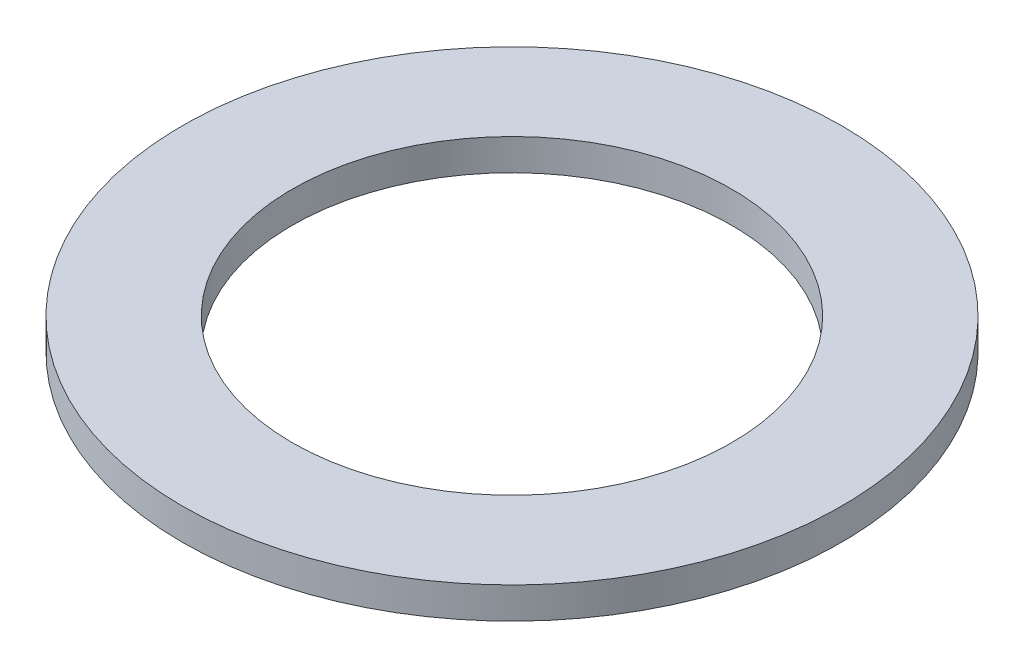
ISO-10303-21;
HEADER;
FILE_DESCRIPTION(('STEP AP214'),'2;1');
FILE_NAME('part.step','',(''),(''),'','','');
FILE_SCHEMA(('AUTOMOTIVE_DESIGN { 1 0 10303 214 1 1 1 1 }'));
ENDSEC;
DATA;
#1=APPLICATION_CONTEXT('core data for automotive mechanical design processes');
#2=APPLICATION_PROTOCOL_DEFINITION('international standard','automotive_design',2000,#1);
#3=PRODUCT_CONTEXT('',#1,'mechanical');
#4=PRODUCT('Part','Part','',(#3));
#5=PRODUCT_RELATED_PRODUCT_CATEGORY('part','',(#4));
#6=PRODUCT_DEFINITION_FORMATION('','',#4);
#7=PRODUCT_DEFINITION_CONTEXT('part definition',#1,'design');
#8=PRODUCT_DEFINITION('design','',#6,#7);
#9=PRODUCT_DEFINITION_SHAPE('','',#8);
#10=(LENGTH_UNIT() NAMED_UNIT(*) SI_UNIT(.MILLI.,.METRE.));
#11=(NAMED_UNIT(*) PLANE_ANGLE_UNIT() SI_UNIT($,.RADIAN.));
#12=(NAMED_UNIT(*) SI_UNIT($,.STERADIAN.) SOLID_ANGLE_UNIT());
#13=UNCERTAINTY_MEASURE_WITH_UNIT(LENGTH_MEASURE(1.E-05),#10,'distance_accuracy_value','');
#14=(GEOMETRIC_REPRESENTATION_CONTEXT(3) GLOBAL_UNCERTAINTY_ASSIGNED_CONTEXT((#13)) GLOBAL_UNIT_ASSIGNED_CONTEXT((#10,
#11,#12)) REPRESENTATION_CONTEXT('',''));
#15=CARTESIAN_POINT('',(0.,0.,0.));
#16=DIRECTION('',(0.,0.,1.));
#17=DIRECTION('',(1.,0.,0.));
#18=AXIS2_PLACEMENT_3D('',#15,#16,#17);
#19=CARTESIAN_POINT('',(0.,1.,0.));
#20=DIRECTION('',(0.,1.,0.));
#21=DIRECTION('',(0.,0.,1.));
#22=AXIS2_PLACEMENT_3D('',#19,#20,#21);
#23=PLANE('',#22);
#24=CARTESIAN_POINT('',(0.,1.,0.));
#25=DIRECTION('',(0.,1.,0.));
#26=DIRECTION('',(0.,0.,1.));
#27=AXIS2_PLACEMENT_3D('',#24,#25,#26);
#28=CIRCLE('',#27,10.5);
#29=CARTESIAN_POINT('',(0.,1.,10.5));
#30=VERTEX_POINT('',#29);
#31=EDGE_CURVE('E10',#30,#30,#28,.T.);
#32=ORIENTED_EDGE('',*,*,#31,.T.);
#33=EDGE_LOOP('',(#32));
#34=FACE_BOUND('',#33,.T.);
#35=CARTESIAN_POINT('',(0.,1.,0.));
#36=DIRECTION('',(0.,1.,0.));
#37=DIRECTION('',(0.,0.,1.));
#38=AXIS2_PLACEMENT_3D('',#35,#36,#37);
#39=CIRCLE('',#38,7.);
#40=CARTESIAN_POINT('',(0.,1.,7.));
#41=VERTEX_POINT('',#40);
#42=EDGE_CURVE('E50',#41,#41,#39,.T.);
#43=ORIENTED_EDGE('',*,*,#42,.F.);
#44=EDGE_LOOP('',(#43));
#45=FACE_BOUND('',#44,.T.);
#46=ADVANCED_FACE('F37',(#34,#45),#23,.T.);
#47=CARTESIAN_POINT('',(0.,0.,0.));
#48=DIRECTION('',(0.,1.,0.));
#49=DIRECTION('',(0.,0.,1.));
#50=AXIS2_PLACEMENT_3D('',#47,#48,#49);
#51=PLANE('',#50);
#52=CARTESIAN_POINT('',(0.,0.,0.));
#53=DIRECTION('',(0.,1.,0.));
#54=DIRECTION('',(0.,0.,1.));
#55=AXIS2_PLACEMENT_3D('',#52,#53,#54);
#56=CIRCLE('',#55,10.5);
#57=CARTESIAN_POINT('',(0.,0.,10.5));
#58=VERTEX_POINT('',#57);
#59=EDGE_CURVE('E41',#58,#58,#56,.T.);
#60=ORIENTED_EDGE('',*,*,#59,.F.);
#61=EDGE_LOOP('',(#60));
#62=FACE_BOUND('',#61,.T.);
#63=CARTESIAN_POINT('',(0.,0.,0.));
#64=DIRECTION('',(0.,1.,0.));
#65=DIRECTION('',(0.,0.,1.));
#66=AXIS2_PLACEMENT_3D('',#63,#64,#65);
#67=CIRCLE('',#66,7.);
#68=CARTESIAN_POINT('',(0.,0.,7.));
#69=VERTEX_POINT('',#68);
#70=EDGE_CURVE('E52',#69,#69,#67,.T.);
#71=ORIENTED_EDGE('',*,*,#70,.T.);
#72=EDGE_LOOP('',(#71));
#73=FACE_BOUND('',#72,.T.);
#74=ADVANCED_FACE('F64',(#62,#73),#51,.F.);
#75=CARTESIAN_POINT('',(0.,1.,0.));
#76=DIRECTION('',(0.,-1.,0.));
#77=DIRECTION('',(0.,0.,-1.));
#78=AXIS2_PLACEMENT_3D('',#75,#76,#77);
#79=CYLINDRICAL_SURFACE('',#78,10.5);
#80=ORIENTED_EDGE('',*,*,#31,.F.);
#81=EDGE_LOOP('',(#80));
#82=FACE_BOUND('',#81,.T.);
#83=ORIENTED_EDGE('',*,*,#59,.T.);
#84=EDGE_LOOP('',(#83));
#85=FACE_BOUND('',#84,.T.);
#86=ADVANCED_FACE('F39',(#82,#85),#79,.T.);
#87=CARTESIAN_POINT('',(0.,1.,0.));
#88=DIRECTION('',(0.,-1.,0.));
#89=DIRECTION('',(0.,0.,-1.));
#90=AXIS2_PLACEMENT_3D('',#87,#88,#89);
#91=CYLINDRICAL_SURFACE('',#90,7.);
#92=ORIENTED_EDGE('',*,*,#42,.T.);
#93=EDGE_LOOP('',(#92));
#94=FACE_BOUND('',#93,.T.);
#95=ORIENTED_EDGE('',*,*,#70,.F.);
#96=EDGE_LOOP('',(#95));
#97=FACE_BOUND('',#96,.T.);
#98=ADVANCED_FACE('F60',(#94,#97),#91,.F.);
#99=CLOSED_SHELL('',(#46,#74,#86,#98));
#100=MANIFOLD_SOLID_BREP('B2',#99);
#101=ADVANCED_BREP_SHAPE_REPRESENTATION('',(#18,#100),#14);
#102=SHAPE_DEFINITION_REPRESENTATION(#9,#101);
ENDSEC;
END-ISO-10303-21;
